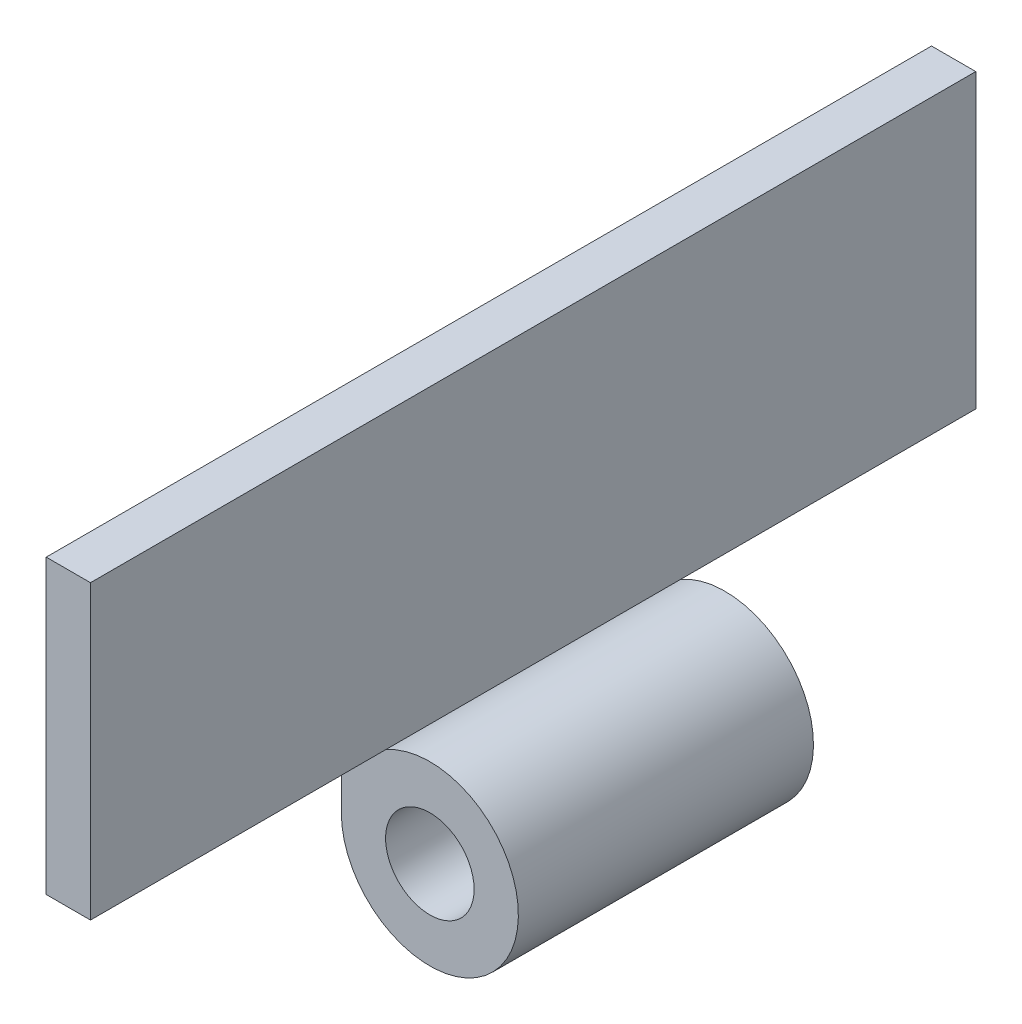
ISO-10303-21;
HEADER;
FILE_DESCRIPTION(('STEP AP214'),'2;1');
FILE_NAME('part.step','',(''),(''),'','','');
FILE_SCHEMA(('AUTOMOTIVE_DESIGN { 1 0 10303 214 1 1 1 1 }'));
ENDSEC;
DATA;
#1=APPLICATION_CONTEXT('core data for automotive mechanical design processes');
#2=APPLICATION_PROTOCOL_DEFINITION('international standard','automotive_design',2000,#1);
#3=PRODUCT_CONTEXT('',#1,'mechanical');
#4=PRODUCT('Part','Part','',(#3));
#5=PRODUCT_RELATED_PRODUCT_CATEGORY('part','',(#4));
#6=PRODUCT_DEFINITION_FORMATION('','',#4);
#7=PRODUCT_DEFINITION_CONTEXT('part definition',#1,'design');
#8=PRODUCT_DEFINITION('design','',#6,#7);
#9=PRODUCT_DEFINITION_SHAPE('','',#8);
#10=(LENGTH_UNIT() NAMED_UNIT(*) SI_UNIT(.MILLI.,.METRE.));
#11=(NAMED_UNIT(*) PLANE_ANGLE_UNIT() SI_UNIT($,.RADIAN.));
#12=(NAMED_UNIT(*) SI_UNIT($,.STERADIAN.) SOLID_ANGLE_UNIT());
#13=UNCERTAINTY_MEASURE_WITH_UNIT(LENGTH_MEASURE(1.E-05),#10,'distance_accuracy_value','');
#14=(GEOMETRIC_REPRESENTATION_CONTEXT(3) GLOBAL_UNCERTAINTY_ASSIGNED_CONTEXT((#13)) GLOBAL_UNIT_ASSIGNED_CONTEXT((#10,
#11,#12)) REPRESENTATION_CONTEXT('',''));
#15=CARTESIAN_POINT('',(0.,0.,0.));
#16=DIRECTION('',(0.,0.,1.));
#17=DIRECTION('',(1.,0.,0.));
#18=AXIS2_PLACEMENT_3D('',#15,#16,#17);
#19=CARTESIAN_POINT('',(0.,0.,-30.));
#20=DIRECTION('',(0.,0.,1.));
#21=DIRECTION('',(1.,0.,0.));
#22=AXIS2_PLACEMENT_3D('',#19,#20,#21);
#23=CYLINDRICAL_SURFACE('',#22,6.);
#24=DIRECTION('',(0.,0.,1.));
#25=VECTOR('',#24,1.);
#26=CARTESIAN_POINT('',(-6.,0.,-30.));
#27=LINE('',#26,#25);
#28=CARTESIAN_POINT('',(-6.,0.,-10.));
#29=VERTEX_POINT('',#28);
#30=CARTESIAN_POINT('',(-6.,0.,10.));
#31=VERTEX_POINT('',#30);
#32=EDGE_CURVE('E11',#29,#31,#27,.T.);
#33=ORIENTED_EDGE('',*,*,#32,.F.);
#34=CARTESIAN_POINT('',(0.,0.,-10.));
#35=DIRECTION('',(0.,0.,1.));
#36=DIRECTION('',(1.,0.,0.));
#37=AXIS2_PLACEMENT_3D('',#34,#35,#36);
#38=CIRCLE('',#37,6.);
#39=CARTESIAN_POINT('',(-3.,5.19615242270663,-10.));
#40=VERTEX_POINT('',#39);
#41=EDGE_CURVE('E99',#29,#40,#38,.T.);
#42=ORIENTED_EDGE('',*,*,#41,.T.);
#43=DIRECTION('',(0.,0.,1.));
#44=VECTOR('',#43,1.);
#45=CARTESIAN_POINT('',(-3.,5.19615242270663,-30.));
#46=LINE('',#45,#44);
#47=CARTESIAN_POINT('',(-3.,5.19615242270663,10.));
#48=VERTEX_POINT('',#47);
#49=EDGE_CURVE('E120',#40,#48,#46,.T.);
#50=ORIENTED_EDGE('',*,*,#49,.T.);
#51=CARTESIAN_POINT('',(0.,0.,10.));
#52=DIRECTION('',(0.,0.,1.));
#53=DIRECTION('',(1.,0.,0.));
#54=AXIS2_PLACEMENT_3D('',#51,#52,#53);
#55=CIRCLE('',#54,6.);
#56=EDGE_CURVE('E119',#31,#48,#55,.T.);
#57=ORIENTED_EDGE('',*,*,#56,.F.);
#58=EDGE_LOOP('',(#33,#42,#50,#57));
#59=FACE_BOUND('',#58,.T.);
#60=ADVANCED_FACE('F39',(#59),#23,.T.);
#61=CARTESIAN_POINT('',(0.,0.,-30.));
#62=DIRECTION('',(0.,0.,1.));
#63=DIRECTION('',(1.,0.,0.));
#64=AXIS2_PLACEMENT_3D('',#61,#62,#63);
#65=CYLINDRICAL_SURFACE('',#64,3.);
#66=CARTESIAN_POINT('',(0.,0.,10.));
#67=DIRECTION('',(0.,0.,1.));
#68=DIRECTION('',(1.,0.,0.));
#69=AXIS2_PLACEMENT_3D('',#66,#67,#68);
#70=CIRCLE('',#69,3.);
#71=CARTESIAN_POINT('',(3.,0.,10.));
#72=VERTEX_POINT('',#71);
#73=EDGE_CURVE('E42',#72,#72,#70,.F.);
#74=ORIENTED_EDGE('',*,*,#73,.F.);
#75=EDGE_LOOP('',(#74));
#76=FACE_BOUND('',#75,.T.);
#77=CARTESIAN_POINT('',(0.,0.,-10.));
#78=DIRECTION('',(0.,0.,-1.));
#79=DIRECTION('',(-1.,0.,0.));
#80=AXIS2_PLACEMENT_3D('',#77,#78,#79);
#81=CIRCLE('',#80,3.);
#82=CARTESIAN_POINT('',(-3.,0.,-10.));
#83=VERTEX_POINT('',#82);
#84=EDGE_CURVE('E133',#83,#83,#81,.F.);
#85=ORIENTED_EDGE('',*,*,#84,.F.);
#86=EDGE_LOOP('',(#85));
#87=FACE_BOUND('',#86,.T.);
#88=ADVANCED_FACE('F183',(#76,#87),#65,.F.);
#89=CARTESIAN_POINT('',(-6.,0.,-30.));
#90=DIRECTION('',(-1.,0.,0.));
#91=DIRECTION('',(0.,-1.,0.));
#92=AXIS2_PLACEMENT_3D('',#89,#90,#91);
#93=PLANE('',#92);
#94=DIRECTION('',(0.,-1.,0.));
#95=VECTOR('',#94,1.);
#96=CARTESIAN_POINT('',(-6.,0.,-30.));
#97=LINE('',#96,#95);
#98=CARTESIAN_POINT('',(-6.,25.,-30.));
#99=VERTEX_POINT('',#98);
#100=CARTESIAN_POINT('',(-6.,5.19615242270663,-30.));
#101=VERTEX_POINT('',#100);
#102=EDGE_CURVE('E166',#99,#101,#97,.T.);
#103=ORIENTED_EDGE('',*,*,#102,.T.);
#104=DIRECTION('',(0.,0.,-1.));
#105=VECTOR('',#104,1.);
#106=CARTESIAN_POINT('',(-6.,5.19615242270663,-10.));
#107=LINE('',#106,#105);
#108=CARTESIAN_POINT('',(-6.,5.19615242270663,-10.));
#109=VERTEX_POINT('',#108);
#110=EDGE_CURVE('E56',#109,#101,#107,.T.);
#111=ORIENTED_EDGE('',*,*,#110,.F.);
#112=DIRECTION('',(0.,-1.,0.));
#113=VECTOR('',#112,1.);
#114=CARTESIAN_POINT('',(-6.,5.19615242270663,-10.));
#115=LINE('',#114,#113);
#116=EDGE_CURVE('E103',#109,#29,#115,.T.);
#117=ORIENTED_EDGE('',*,*,#116,.T.);
#118=ORIENTED_EDGE('',*,*,#32,.T.);
#119=DIRECTION('',(0.,-1.,0.));
#120=VECTOR('',#119,1.);
#121=CARTESIAN_POINT('',(-6.,5.19615242270663,10.));
#122=LINE('',#121,#120);
#123=CARTESIAN_POINT('',(-6.,5.19615242270663,10.));
#124=VERTEX_POINT('',#123);
#125=EDGE_CURVE('E131',#124,#31,#122,.T.);
#126=ORIENTED_EDGE('',*,*,#125,.F.);
#127=DIRECTION('',(0.,0.,1.));
#128=VECTOR('',#127,1.);
#129=CARTESIAN_POINT('',(-6.,5.19615242270663,10.));
#130=LINE('',#129,#128);
#131=CARTESIAN_POINT('',(-6.,5.19615242270663,30.));
#132=VERTEX_POINT('',#131);
#133=EDGE_CURVE('E141',#124,#132,#130,.T.);
#134=ORIENTED_EDGE('',*,*,#133,.T.);
#135=DIRECTION('',(0.,-1.,0.));
#136=VECTOR('',#135,1.);
#137=CARTESIAN_POINT('',(-6.,0.,30.));
#138=LINE('',#137,#136);
#139=CARTESIAN_POINT('',(-6.,25.,30.));
#140=VERTEX_POINT('',#139);
#141=EDGE_CURVE('E155',#140,#132,#138,.T.);
#142=ORIENTED_EDGE('',*,*,#141,.F.);
#143=DIRECTION('',(0.,0.,1.));
#144=VECTOR('',#143,1.);
#145=CARTESIAN_POINT('',(-6.,25.,-30.));
#146=LINE('',#145,#144);
#147=EDGE_CURVE('E48',#99,#140,#146,.T.);
#148=ORIENTED_EDGE('',*,*,#147,.F.);
#149=EDGE_LOOP('',(#103,#111,#117,#118,#126,#134,#142,#148));
#150=FACE_BOUND('',#149,.T.);
#151=ADVANCED_FACE('F112',(#150),#93,.T.);
#152=CARTESIAN_POINT('',(0.,0.,-30.));
#153=DIRECTION('',(0.,0.,1.));
#154=DIRECTION('',(1.,0.,0.));
#155=AXIS2_PLACEMENT_3D('',#152,#153,#154);
#156=PLANE('',#155);
#157=DIRECTION('',(-1.,0.,0.));
#158=VECTOR('',#157,1.);
#159=CARTESIAN_POINT('',(-3.,5.19615242270663,-30.));
#160=LINE('',#159,#158);
#161=CARTESIAN_POINT('',(-3.,5.19615242270663,-30.));
#162=VERTEX_POINT('',#161);
#163=EDGE_CURVE('E110',#162,#101,#160,.T.);
#164=ORIENTED_EDGE('',*,*,#163,.T.);
#165=ORIENTED_EDGE('',*,*,#102,.F.);
#166=DIRECTION('',(-1.,0.,0.));
#167=VECTOR('',#166,1.);
#168=CARTESIAN_POINT('',(-6.,25.,-30.));
#169=LINE('',#168,#167);
#170=CARTESIAN_POINT('',(-3.,25.,-30.));
#171=VERTEX_POINT('',#170);
#172=EDGE_CURVE('E163',#171,#99,#169,.T.);
#173=ORIENTED_EDGE('',*,*,#172,.F.);
#174=DIRECTION('',(0.,1.,0.));
#175=VECTOR('',#174,1.);
#176=CARTESIAN_POINT('',(-3.,25.,-30.));
#177=LINE('',#176,#175);
#178=EDGE_CURVE('E159',#162,#171,#177,.T.);
#179=ORIENTED_EDGE('',*,*,#178,.F.);
#180=EDGE_LOOP('',(#164,#165,#173,#179));
#181=FACE_BOUND('',#180,.T.);
#182=ADVANCED_FACE('F198',(#181),#156,.F.);
#183=CARTESIAN_POINT('',(-6.,25.,-30.));
#184=DIRECTION('',(0.,1.,0.));
#185=DIRECTION('',(0.,0.,1.));
#186=AXIS2_PLACEMENT_3D('',#183,#184,#185);
#187=PLANE('',#186);
#188=ORIENTED_EDGE('',*,*,#147,.T.);
#189=DIRECTION('',(-1.,0.,0.));
#190=VECTOR('',#189,1.);
#191=CARTESIAN_POINT('',(-6.,25.,30.));
#192=LINE('',#191,#190);
#193=CARTESIAN_POINT('',(-3.,25.,30.));
#194=VERTEX_POINT('',#193);
#195=EDGE_CURVE('E151',#194,#140,#192,.T.);
#196=ORIENTED_EDGE('',*,*,#195,.F.);
#197=DIRECTION('',(0.,0.,1.));
#198=VECTOR('',#197,1.);
#199=CARTESIAN_POINT('',(-3.,25.,-30.));
#200=LINE('',#199,#198);
#201=EDGE_CURVE('E171',#171,#194,#200,.T.);
#202=ORIENTED_EDGE('',*,*,#201,.F.);
#203=ORIENTED_EDGE('',*,*,#172,.T.);
#204=EDGE_LOOP('',(#188,#196,#202,#203));
#205=FACE_BOUND('',#204,.T.);
#206=ADVANCED_FACE('F239',(#205),#187,.T.);
#207=CARTESIAN_POINT('',(-3.,25.,-30.));
#208=DIRECTION('',(1.,0.,0.));
#209=DIRECTION('',(0.,1.,0.));
#210=AXIS2_PLACEMENT_3D('',#207,#208,#209);
#211=PLANE('',#210);
#212=ORIENTED_EDGE('',*,*,#201,.T.);
#213=DIRECTION('',(0.,1.,0.));
#214=VECTOR('',#213,1.);
#215=CARTESIAN_POINT('',(-3.,25.,30.));
#216=LINE('',#215,#214);
#217=CARTESIAN_POINT('',(-3.,5.19615242270663,30.));
#218=VERTEX_POINT('',#217);
#219=EDGE_CURVE('E147',#218,#194,#216,.T.);
#220=ORIENTED_EDGE('',*,*,#219,.F.);
#221=DIRECTION('',(0.,0.,1.));
#222=VECTOR('',#221,1.);
#223=CARTESIAN_POINT('',(-3.,5.19615242270663,10.));
#224=LINE('',#223,#222);
#225=EDGE_CURVE('E139',#48,#218,#224,.T.);
#226=ORIENTED_EDGE('',*,*,#225,.F.);
#227=ORIENTED_EDGE('',*,*,#49,.F.);
#228=EDGE_CURVE('E173',#162,#40,#46,.T.);
#229=ORIENTED_EDGE('',*,*,#228,.F.);
#230=ORIENTED_EDGE('',*,*,#178,.T.);
#231=EDGE_LOOP('',(#212,#220,#226,#227,#229,#230));
#232=FACE_BOUND('',#231,.T.);
#233=ADVANCED_FACE('F202',(#232),#211,.T.);
#234=CARTESIAN_POINT('',(0.,0.,30.));
#235=DIRECTION('',(0.,0.,1.));
#236=DIRECTION('',(1.,0.,0.));
#237=AXIS2_PLACEMENT_3D('',#234,#235,#236);
#238=PLANE('',#237);
#239=DIRECTION('',(-1.,0.,0.));
#240=VECTOR('',#239,1.);
#241=CARTESIAN_POINT('',(-3.,5.19615242270663,30.));
#242=LINE('',#241,#240);
#243=EDGE_CURVE('E127',#218,#132,#242,.T.);
#244=ORIENTED_EDGE('',*,*,#243,.F.);
#245=ORIENTED_EDGE('',*,*,#219,.T.);
#246=ORIENTED_EDGE('',*,*,#195,.T.);
#247=ORIENTED_EDGE('',*,*,#141,.T.);
#248=EDGE_LOOP('',(#244,#245,#246,#247));
#249=FACE_BOUND('',#248,.T.);
#250=ADVANCED_FACE('F208',(#249),#238,.T.);
#251=CARTESIAN_POINT('',(0.,0.,10.));
#252=DIRECTION('',(0.,0.,1.));
#253=DIRECTION('',(1.,0.,0.));
#254=AXIS2_PLACEMENT_3D('',#251,#252,#253);
#255=PLANE('',#254);
#256=ORIENTED_EDGE('',*,*,#56,.T.);
#257=DIRECTION('',(-1.,0.,0.));
#258=VECTOR('',#257,1.);
#259=CARTESIAN_POINT('',(-3.,5.19615242270663,10.));
#260=LINE('',#259,#258);
#261=EDGE_CURVE('E126',#48,#124,#260,.T.);
#262=ORIENTED_EDGE('',*,*,#261,.T.);
#263=ORIENTED_EDGE('',*,*,#125,.T.);
#264=EDGE_LOOP('',(#256,#262,#263));
#265=FACE_BOUND('',#264,.T.);
#266=ORIENTED_EDGE('',*,*,#73,.T.);
#267=EDGE_LOOP('',(#266));
#268=FACE_BOUND('',#267,.T.);
#269=ADVANCED_FACE('F181',(#265,#268),#255,.T.);
#270=CARTESIAN_POINT('',(-3.,5.19615242270663,10.));
#271=DIRECTION('',(0.,1.,0.));
#272=DIRECTION('',(-1.,0.,0.));
#273=AXIS2_PLACEMENT_3D('',#270,#271,#272);
#274=PLANE('',#273);
#275=ORIENTED_EDGE('',*,*,#243,.T.);
#276=ORIENTED_EDGE('',*,*,#133,.F.);
#277=ORIENTED_EDGE('',*,*,#261,.F.);
#278=ORIENTED_EDGE('',*,*,#225,.T.);
#279=EDGE_LOOP('',(#275,#276,#277,#278));
#280=FACE_BOUND('',#279,.T.);
#281=ADVANCED_FACE('F206',(#280),#274,.F.);
#282=CARTESIAN_POINT('',(0.,0.,-10.));
#283=DIRECTION('',(0.,0.,-1.));
#284=DIRECTION('',(1.,0.,0.));
#285=AXIS2_PLACEMENT_3D('',#282,#283,#284);
#286=PLANE('',#285);
#287=ORIENTED_EDGE('',*,*,#41,.F.);
#288=ORIENTED_EDGE('',*,*,#116,.F.);
#289=DIRECTION('',(-1.,0.,0.));
#290=VECTOR('',#289,1.);
#291=CARTESIAN_POINT('',(-3.,5.19615242270663,-10.));
#292=LINE('',#291,#290);
#293=EDGE_CURVE('E104',#40,#109,#292,.T.);
#294=ORIENTED_EDGE('',*,*,#293,.F.);
#295=EDGE_LOOP('',(#287,#288,#294));
#296=FACE_BOUND('',#295,.T.);
#297=ORIENTED_EDGE('',*,*,#84,.T.);
#298=EDGE_LOOP('',(#297));
#299=FACE_BOUND('',#298,.T.);
#300=ADVANCED_FACE('F101',(#296,#299),#286,.T.);
#301=CARTESIAN_POINT('',(-3.,5.19615242270663,-10.));
#302=DIRECTION('',(0.,-1.,0.));
#303=DIRECTION('',(1.,0.,0.));
#304=AXIS2_PLACEMENT_3D('',#301,#302,#303);
#305=PLANE('',#304);
#306=ORIENTED_EDGE('',*,*,#163,.F.);
#307=ORIENTED_EDGE('',*,*,#228,.T.);
#308=ORIENTED_EDGE('',*,*,#293,.T.);
#309=ORIENTED_EDGE('',*,*,#110,.T.);
#310=EDGE_LOOP('',(#306,#307,#308,#309));
#311=FACE_BOUND('',#310,.T.);
#312=ADVANCED_FACE('F200',(#311),#305,.T.);
#313=CLOSED_SHELL('',(#60,#88,#151,#182,#206,#233,#250,#269,#281,#300,#312));
#314=MANIFOLD_SOLID_BREP('B2',#313);
#315=ADVANCED_BREP_SHAPE_REPRESENTATION('',(#18,#314),#14);
#316=SHAPE_DEFINITION_REPRESENTATION(#9,#315);
ENDSEC;
END-ISO-10303-21;
